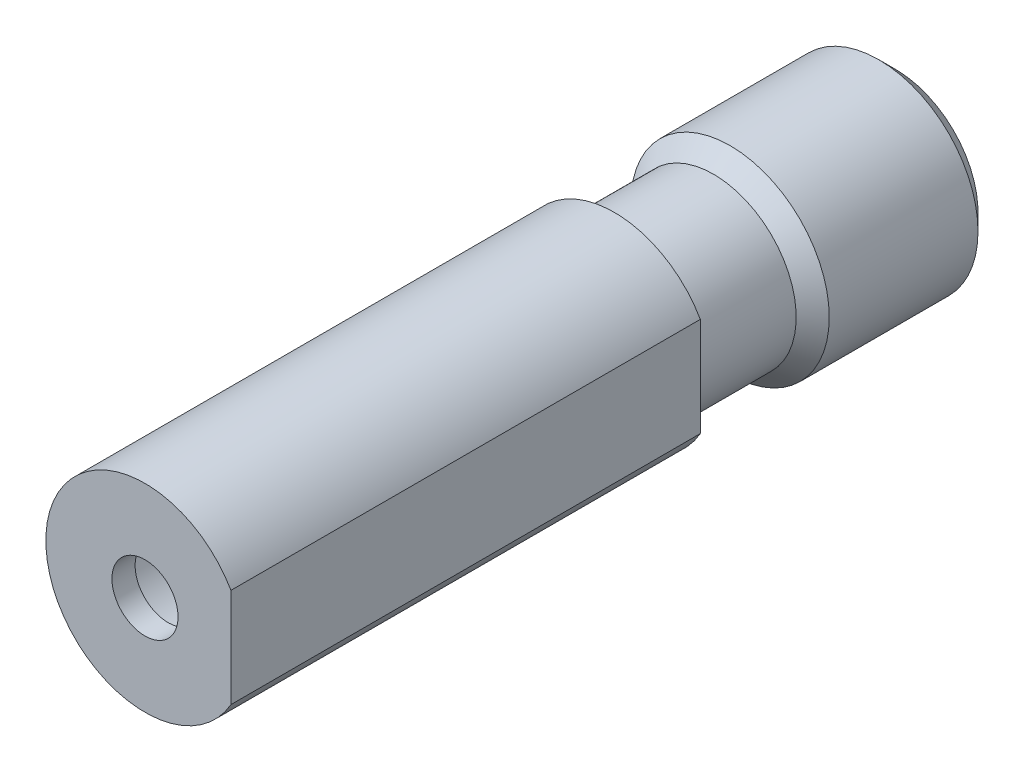
ISO-10303-21;
HEADER;
FILE_DESCRIPTION(('STEP AP214'),'2;1');
FILE_NAME('part.step','',(''),(''),'','','');
FILE_SCHEMA(('AUTOMOTIVE_DESIGN { 1 0 10303 214 1 1 1 1 }'));
ENDSEC;
DATA;
#1=APPLICATION_CONTEXT('core data for automotive mechanical design processes');
#2=APPLICATION_PROTOCOL_DEFINITION('international standard','automotive_design',2000,#1);
#3=PRODUCT_CONTEXT('',#1,'mechanical');
#4=PRODUCT('Part','Part','',(#3));
#5=PRODUCT_RELATED_PRODUCT_CATEGORY('part','',(#4));
#6=PRODUCT_DEFINITION_FORMATION('','',#4);
#7=PRODUCT_DEFINITION_CONTEXT('part definition',#1,'design');
#8=PRODUCT_DEFINITION('design','',#6,#7);
#9=PRODUCT_DEFINITION_SHAPE('','',#8);
#10=(LENGTH_UNIT() NAMED_UNIT(*) SI_UNIT(.MILLI.,.METRE.));
#11=(NAMED_UNIT(*) PLANE_ANGLE_UNIT() SI_UNIT($,.RADIAN.));
#12=(NAMED_UNIT(*) SI_UNIT($,.STERADIAN.) SOLID_ANGLE_UNIT());
#13=UNCERTAINTY_MEASURE_WITH_UNIT(LENGTH_MEASURE(1.E-05),#10,'distance_accuracy_value','');
#14=(GEOMETRIC_REPRESENTATION_CONTEXT(3) GLOBAL_UNCERTAINTY_ASSIGNED_CONTEXT((#13)) GLOBAL_UNIT_ASSIGNED_CONTEXT((#10,
#11,#12)) REPRESENTATION_CONTEXT('',''));
#15=CARTESIAN_POINT('',(0.,0.,0.));
#16=DIRECTION('',(0.,0.,1.));
#17=DIRECTION('',(1.,0.,0.));
#18=AXIS2_PLACEMENT_3D('',#15,#16,#17);
#19=CARTESIAN_POINT('',(0.,0.,22.7));
#20=DIRECTION('',(0.,0.,-1.));
#21=DIRECTION('',(-1.,0.,0.));
#22=AXIS2_PLACEMENT_3D('',#19,#20,#21);
#23=CYLINDRICAL_SURFACE('',#22,3.);
#24=CARTESIAN_POINT('',(0.,0.,8.5));
#25=DIRECTION('',(0.,0.,-1.));
#26=DIRECTION('',(-1.,0.,0.));
#27=AXIS2_PLACEMENT_3D('',#24,#25,#26);
#28=CIRCLE('',#27,3.);
#29=CARTESIAN_POINT('',(2.6,-1.49666295470958,8.5));
#30=VERTEX_POINT('',#29);
#31=CARTESIAN_POINT('',(2.6,1.49666295470958,8.5));
#32=VERTEX_POINT('',#31);
#33=EDGE_CURVE('E70',#30,#32,#28,.T.);
#34=ORIENTED_EDGE('',*,*,#33,.F.);
#35=DIRECTION('',(0.,0.,-1.));
#36=VECTOR('',#35,1.);
#37=CARTESIAN_POINT('',(2.6,-1.49666295470958,22.7));
#38=LINE('',#37,#36);
#39=CARTESIAN_POINT('',(2.6,-1.49666295470958,22.7));
#40=VERTEX_POINT('',#39);
#41=EDGE_CURVE('E52',#40,#30,#38,.T.);
#42=ORIENTED_EDGE('',*,*,#41,.F.);
#43=CARTESIAN_POINT('',(0.,0.,22.7));
#44=DIRECTION('',(0.,0.,-1.));
#45=DIRECTION('',(-1.,0.,0.));
#46=AXIS2_PLACEMENT_3D('',#43,#44,#45);
#47=CIRCLE('',#46,3.);
#48=CARTESIAN_POINT('',(2.6,1.49666295470958,22.7));
#49=VERTEX_POINT('',#48);
#50=EDGE_CURVE('E75',#40,#49,#47,.T.);
#51=ORIENTED_EDGE('',*,*,#50,.T.);
#52=DIRECTION('',(0.,0.,-1.));
#53=VECTOR('',#52,1.);
#54=CARTESIAN_POINT('',(2.6,1.49666295470958,22.7));
#55=LINE('',#54,#53);
#56=EDGE_CURVE('E58',#49,#32,#55,.T.);
#57=ORIENTED_EDGE('',*,*,#56,.T.);
#58=EDGE_LOOP('',(#34,#42,#51,#57));
#59=FACE_BOUND('',#58,.T.);
#60=ADVANCED_FACE('F35',(#59),#23,.T.);
#61=CARTESIAN_POINT('',(2.6,1.49666295470958,22.7));
#62=DIRECTION('',(1.,0.,0.));
#63=DIRECTION('',(0.,0.,-1.));
#64=AXIS2_PLACEMENT_3D('',#61,#62,#63);
#65=PLANE('',#64);
#66=DIRECTION('',(0.,-1.,0.));
#67=VECTOR('',#66,1.);
#68=CARTESIAN_POINT('',(2.6,1.49666295470958,8.5));
#69=LINE('',#68,#67);
#70=EDGE_CURVE('E65',#32,#30,#69,.T.);
#71=ORIENTED_EDGE('',*,*,#70,.F.);
#72=ORIENTED_EDGE('',*,*,#56,.F.);
#73=DIRECTION('',(0.,-1.,0.));
#74=VECTOR('',#73,1.);
#75=CARTESIAN_POINT('',(2.6,1.49666295470958,22.7));
#76=LINE('',#75,#74);
#77=EDGE_CURVE('E67',#49,#40,#76,.T.);
#78=ORIENTED_EDGE('',*,*,#77,.T.);
#79=ORIENTED_EDGE('',*,*,#41,.T.);
#80=EDGE_LOOP('',(#71,#72,#78,#79));
#81=FACE_BOUND('',#80,.T.);
#82=ADVANCED_FACE('F63',(#81),#65,.T.);
#83=CARTESIAN_POINT('',(0.,0.,22.7));
#84=DIRECTION('',(0.,0.,-1.));
#85=DIRECTION('',(-1.,0.,0.));
#86=AXIS2_PLACEMENT_3D('',#83,#84,#85);
#87=PLANE('',#86);
#88=CARTESIAN_POINT('',(0.,0.,22.7));
#89=DIRECTION('',(0.,0.,-1.));
#90=DIRECTION('',(-1.,0.,0.));
#91=AXIS2_PLACEMENT_3D('',#88,#89,#90);
#92=CIRCLE('',#91,0.999999999999994);
#93=CARTESIAN_POINT('',(-0.999999999999994,0.,22.7));
#94=VERTEX_POINT('',#93);
#95=EDGE_CURVE('E93',#94,#94,#92,.T.);
#96=ORIENTED_EDGE('',*,*,#95,.T.);
#97=EDGE_LOOP('',(#96));
#98=FACE_BOUND('',#97,.T.);
#99=ORIENTED_EDGE('',*,*,#50,.F.);
#100=ORIENTED_EDGE('',*,*,#77,.F.);
#101=EDGE_LOOP('',(#99,#100));
#102=FACE_BOUND('',#101,.T.);
#103=ADVANCED_FACE('F125',(#98,#102),#87,.F.);
#104=CARTESIAN_POINT('',(0.,0.,8.5));
#105=DIRECTION('',(0.,0.,-1.));
#106=DIRECTION('',(-1.,0.,0.));
#107=AXIS2_PLACEMENT_3D('',#104,#105,#106);
#108=PLANE('',#107);
#109=CARTESIAN_POINT('',(0.,0.,8.5));
#110=DIRECTION('',(0.,0.,-1.));
#111=DIRECTION('',(-1.,0.,0.));
#112=AXIS2_PLACEMENT_3D('',#109,#110,#111);
#113=CIRCLE('',#112,2.5);
#114=CARTESIAN_POINT('',(-2.5,0.,8.5));
#115=VERTEX_POINT('',#114);
#116=EDGE_CURVE('E68',#115,#115,#113,.T.);
#117=ORIENTED_EDGE('',*,*,#116,.F.);
#118=EDGE_LOOP('',(#117));
#119=FACE_BOUND('',#118,.T.);
#120=ORIENTED_EDGE('',*,*,#33,.T.);
#121=ORIENTED_EDGE('',*,*,#70,.T.);
#122=EDGE_LOOP('',(#120,#121));
#123=FACE_BOUND('',#122,.T.);
#124=ADVANCED_FACE('F74',(#119,#123),#108,.T.);
#125=CARTESIAN_POINT('',(0.,0.,8.5));
#126=DIRECTION('',(0.,0.,-1.));
#127=DIRECTION('',(-1.,0.,0.));
#128=AXIS2_PLACEMENT_3D('',#125,#126,#127);
#129=CYLINDRICAL_SURFACE('',#128,2.5);
#130=ORIENTED_EDGE('',*,*,#116,.T.);
#131=EDGE_LOOP('',(#130));
#132=FACE_BOUND('',#131,.T.);
#133=CARTESIAN_POINT('',(0.,0.,5.5));
#134=DIRECTION('',(0.,0.,-1.));
#135=DIRECTION('',(-1.,0.,0.));
#136=AXIS2_PLACEMENT_3D('',#133,#134,#135);
#137=CIRCLE('',#136,2.5);
#138=CARTESIAN_POINT('',(-2.5,0.,5.5));
#139=VERTEX_POINT('',#138);
#140=EDGE_CURVE('E90',#139,#139,#137,.T.);
#141=ORIENTED_EDGE('',*,*,#140,.F.);
#142=EDGE_LOOP('',(#141));
#143=FACE_BOUND('',#142,.T.);
#144=ADVANCED_FACE('F111',(#132,#143),#129,.T.);
#145=CARTESIAN_POINT('',(0.,0.,0.));
#146=DIRECTION('',(0.,0.,-1.));
#147=DIRECTION('',(-1.,0.,0.));
#148=AXIS2_PLACEMENT_3D('',#145,#146,#147);
#149=PLANE('',#148);
#150=CARTESIAN_POINT('',(0.,0.,0.));
#151=DIRECTION('',(0.,0.,-1.));
#152=DIRECTION('',(-1.,0.,0.));
#153=AXIS2_PLACEMENT_3D('',#150,#151,#152);
#154=CIRCLE('',#153,2.5);
#155=CARTESIAN_POINT('',(-2.5,0.,0.));
#156=VERTEX_POINT('',#155);
#157=EDGE_CURVE('E44',#156,#156,#154,.T.);
#158=ORIENTED_EDGE('',*,*,#157,.T.);
#159=EDGE_LOOP('',(#158));
#160=FACE_BOUND('',#159,.T.);
#161=CARTESIAN_POINT('',(0.,0.,0.));
#162=DIRECTION('',(0.,0.,-1.));
#163=DIRECTION('',(-1.,0.,0.));
#164=AXIS2_PLACEMENT_3D('',#161,#162,#163);
#165=CIRCLE('',#164,1.99999999999999);
#166=CARTESIAN_POINT('',(-1.99999999999999,0.,0.));
#167=VERTEX_POINT('',#166);
#168=EDGE_CURVE('E102',#167,#167,#165,.T.);
#169=ORIENTED_EDGE('',*,*,#168,.F.);
#170=EDGE_LOOP('',(#169));
#171=FACE_BOUND('',#170,.T.);
#172=ADVANCED_FACE('F108',(#160,#171),#149,.T.);
#173=CARTESIAN_POINT('',(0.,0.,8.5));
#174=DIRECTION('',(0.,0.,-1.));
#175=DIRECTION('',(-1.,0.,0.));
#176=AXIS2_PLACEMENT_3D('',#173,#174,#175);
#177=CYLINDRICAL_SURFACE('',#176,3.);
#178=CARTESIAN_POINT('',(0.,0.,0.499999999999999));
#179=DIRECTION('',(0.,0.,-1.));
#180=DIRECTION('',(-1.,0.,0.));
#181=AXIS2_PLACEMENT_3D('',#178,#179,#180);
#182=CIRCLE('',#181,3.);
#183=CARTESIAN_POINT('',(-3.,0.,0.499999999999999));
#184=VERTEX_POINT('',#183);
#185=EDGE_CURVE('E11',#184,#184,#182,.F.);
#186=ORIENTED_EDGE('',*,*,#185,.T.);
#187=EDGE_LOOP('',(#186));
#188=FACE_BOUND('',#187,.T.);
#189=CARTESIAN_POINT('',(0.,0.,5.));
#190=DIRECTION('',(0.,0.,-1.));
#191=DIRECTION('',(-1.,0.,0.));
#192=AXIS2_PLACEMENT_3D('',#189,#190,#191);
#193=CIRCLE('',#192,3.);
#194=CARTESIAN_POINT('',(-3.,0.,5.));
#195=VERTEX_POINT('',#194);
#196=EDGE_CURVE('E72',#195,#195,#193,.T.);
#197=ORIENTED_EDGE('',*,*,#196,.T.);
#198=EDGE_LOOP('',(#197));
#199=FACE_BOUND('',#198,.T.);
#200=ADVANCED_FACE('F110',(#188,#199),#177,.T.);
#201=CARTESIAN_POINT('',(0.,0.,5.));
#202=DIRECTION('',(0.,0.,-1.));
#203=DIRECTION('',(-1.,0.,0.));
#204=AXIS2_PLACEMENT_3D('',#201,#202,#203);
#205=CONICAL_SURFACE('',#204,3.,0.785398163397445);
#206=ORIENTED_EDGE('',*,*,#140,.T.);
#207=EDGE_LOOP('',(#206));
#208=FACE_BOUND('',#207,.T.);
#209=ORIENTED_EDGE('',*,*,#196,.F.);
#210=EDGE_LOOP('',(#209));
#211=FACE_BOUND('',#210,.T.);
#212=ADVANCED_FACE('F117',(#208,#211),#205,.T.);
#213=CARTESIAN_POINT('',(0.,0.,0.));
#214=DIRECTION('',(0.,0.,-1.));
#215=DIRECTION('',(-1.,0.,0.));
#216=AXIS2_PLACEMENT_3D('',#213,#214,#215);
#217=CYLINDRICAL_SURFACE('',#216,0.999999999999999);
#218=ORIENTED_EDGE('',*,*,#95,.F.);
#219=EDGE_LOOP('',(#218));
#220=FACE_BOUND('',#219,.T.);
#221=CARTESIAN_POINT('',(0.,0.,22.));
#222=DIRECTION('',(0.,0.,-1.));
#223=DIRECTION('',(-1.,0.,0.));
#224=AXIS2_PLACEMENT_3D('',#221,#222,#223);
#225=CIRCLE('',#224,1.);
#226=CARTESIAN_POINT('',(-1.,0.,22.));
#227=VERTEX_POINT('',#226);
#228=EDGE_CURVE('E96',#227,#227,#225,.T.);
#229=ORIENTED_EDGE('',*,*,#228,.T.);
#230=EDGE_LOOP('',(#229));
#231=FACE_BOUND('',#230,.T.);
#232=ADVANCED_FACE('F138',(#220,#231),#217,.F.);
#233=CARTESIAN_POINT('',(1.,0.,22.));
#234=DIRECTION('',(0.,0.,1.));
#235=DIRECTION('',(1.,0.,0.));
#236=AXIS2_PLACEMENT_3D('',#233,#234,#235);
#237=PLANE('',#236);
#238=ORIENTED_EDGE('',*,*,#228,.F.);
#239=EDGE_LOOP('',(#238));
#240=FACE_BOUND('',#239,.T.);
#241=CARTESIAN_POINT('',(0.,0.,22.));
#242=DIRECTION('',(0.,0.,-1.));
#243=DIRECTION('',(-1.,0.,0.));
#244=AXIS2_PLACEMENT_3D('',#241,#242,#243);
#245=CIRCLE('',#244,1.99999999999999);
#246=CARTESIAN_POINT('',(-1.99999999999999,0.,22.));
#247=VERTEX_POINT('',#246);
#248=EDGE_CURVE('E99',#247,#247,#245,.T.);
#249=ORIENTED_EDGE('',*,*,#248,.T.);
#250=EDGE_LOOP('',(#249));
#251=FACE_BOUND('',#250,.T.);
#252=ADVANCED_FACE('F141',(#240,#251),#237,.F.);
#253=CARTESIAN_POINT('',(0.,0.,0.));
#254=DIRECTION('',(0.,0.,-1.));
#255=DIRECTION('',(-1.,0.,0.));
#256=AXIS2_PLACEMENT_3D('',#253,#254,#255);
#257=CYLINDRICAL_SURFACE('',#256,1.99999999999999);
#258=ORIENTED_EDGE('',*,*,#248,.F.);
#259=EDGE_LOOP('',(#258));
#260=FACE_BOUND('',#259,.T.);
#261=ORIENTED_EDGE('',*,*,#168,.T.);
#262=EDGE_LOOP('',(#261));
#263=FACE_BOUND('',#262,.T.);
#264=ADVANCED_FACE('F106',(#260,#263),#257,.F.);
#265=CARTESIAN_POINT('',(0.,0.,0.));
#266=DIRECTION('',(0.,0.,1.));
#267=DIRECTION('',(1.,0.,0.));
#268=AXIS2_PLACEMENT_3D('',#265,#266,#267);
#269=CONICAL_SURFACE('',#268,2.5,0.785398163397446);
#270=ORIENTED_EDGE('',*,*,#185,.F.);
#271=EDGE_LOOP('',(#270));
#272=FACE_BOUND('',#271,.T.);
#273=ORIENTED_EDGE('',*,*,#157,.F.);
#274=EDGE_LOOP('',(#273));
#275=FACE_BOUND('',#274,.T.);
#276=ADVANCED_FACE('F37',(#272,#275),#269,.T.);
#277=CLOSED_SHELL('',(#60,#82,#103,#124,#144,#172,#200,#212,#232,#252,#264,#276));
#278=MANIFOLD_SOLID_BREP('B2',#277);
#279=ADVANCED_BREP_SHAPE_REPRESENTATION('',(#18,#278),#14);
#280=SHAPE_DEFINITION_REPRESENTATION(#9,#279);
ENDSEC;
END-ISO-10303-21;
